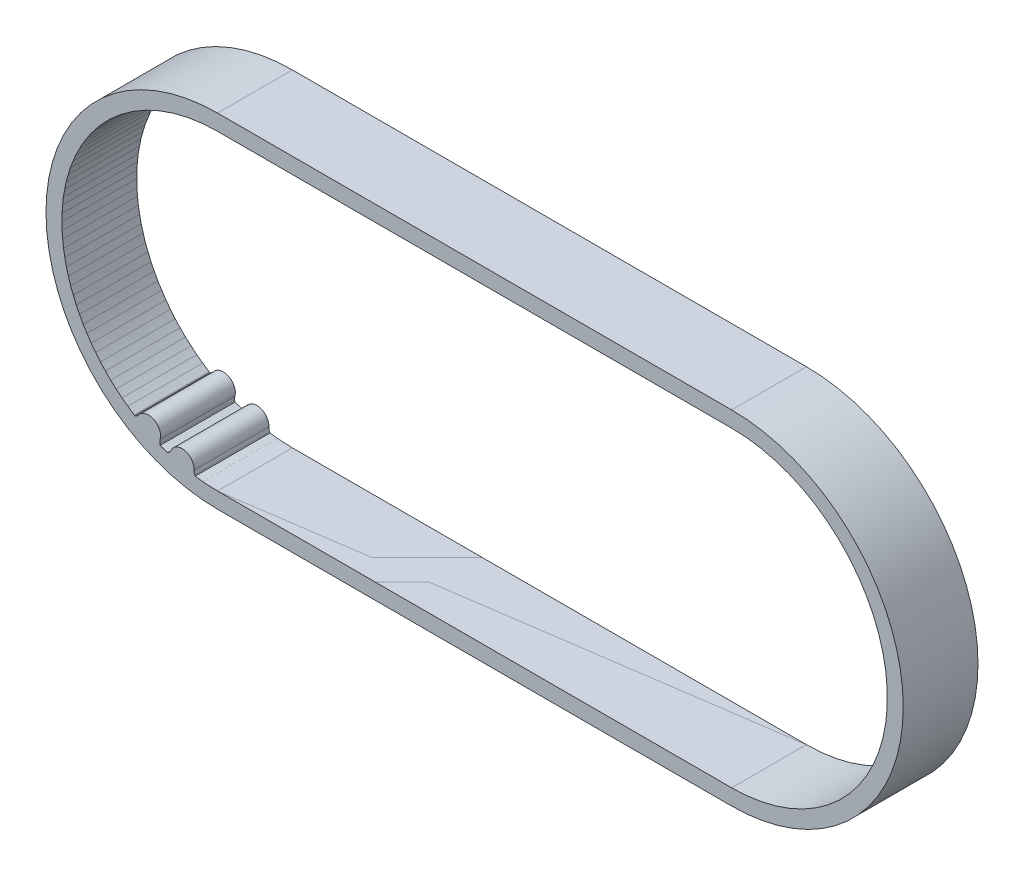
ISO-10303-21;
HEADER;
FILE_DESCRIPTION(('STEP AP214'),'2;1');
FILE_NAME('part.step','',(''),(''),'','','');
FILE_SCHEMA(('AUTOMOTIVE_DESIGN { 1 0 10303 214 1 1 1 1 }'));
ENDSEC;
DATA;
#1=APPLICATION_CONTEXT('core data for automotive mechanical design processes');
#2=APPLICATION_PROTOCOL_DEFINITION('international standard','automotive_design',2000,#1);
#3=PRODUCT_CONTEXT('',#1,'mechanical');
#4=PRODUCT('Part','Part','',(#3));
#5=PRODUCT_RELATED_PRODUCT_CATEGORY('part','',(#4));
#6=PRODUCT_DEFINITION_FORMATION('','',#4);
#7=PRODUCT_DEFINITION_CONTEXT('part definition',#1,'design');
#8=PRODUCT_DEFINITION('design','',#6,#7);
#9=PRODUCT_DEFINITION_SHAPE('','',#8);
#10=(LENGTH_UNIT() NAMED_UNIT(*) SI_UNIT(.MILLI.,.METRE.));
#11=(NAMED_UNIT(*) PLANE_ANGLE_UNIT() SI_UNIT($,.RADIAN.));
#12=(NAMED_UNIT(*) SI_UNIT($,.STERADIAN.) SOLID_ANGLE_UNIT());
#13=UNCERTAINTY_MEASURE_WITH_UNIT(LENGTH_MEASURE(1.E-05),#10,'distance_accuracy_value','');
#14=(GEOMETRIC_REPRESENTATION_CONTEXT(3) GLOBAL_UNCERTAINTY_ASSIGNED_CONTEXT((#13)) GLOBAL_UNIT_ASSIGNED_CONTEXT((#10,
#11,#12)) REPRESENTATION_CONTEXT('',''));
#15=CARTESIAN_POINT('',(0.,0.,0.));
#16=DIRECTION('',(0.,0.,1.));
#17=DIRECTION('',(1.,0.,0.));
#18=AXIS2_PLACEMENT_3D('',#15,#16,#17);
#19=CARTESIAN_POINT('',(-20.625,0.,1.));
#20=DIRECTION('',(0.,0.,-1.));
#21=DIRECTION('',(-1.,0.,0.));
#22=AXIS2_PLACEMENT_3D('',#19,#20,#21);
#23=CYLINDRICAL_SURFACE('',#22,12.4955);
#24=DIRECTION('',(0.,0.,1.));
#25=VECTOR('',#24,1.);
#26=CARTESIAN_POINT('',(-24.6278810964071,-11.8369951508907,3.));
#27=LINE('',#26,#25);
#28=CARTESIAN_POINT('',(-24.6278813586118,-11.836995251793,3.));
#29=VERTEX_POINT('',#28);
#30=CARTESIAN_POINT('',(-24.6278813586118,-11.836995251793,-3.));
#31=VERTEX_POINT('',#30);
#32=EDGE_CURVE('P0_E329',#29,#31,#27,.F.);
#33=ORIENTED_EDGE('',*,*,#32,.T.);
#34=CARTESIAN_POINT('',(-20.625,0.,-3.));
#35=DIRECTION('',(0.,0.,-1.));
#36=DIRECTION('',(-1.,0.,0.));
#37=AXIS2_PLACEMENT_3D('',#34,#35,#36);
#38=CIRCLE('',#37,12.4955);
#39=CARTESIAN_POINT('',(-25.2221486954956,-11.619111158841,-3.));
#40=VERTEX_POINT('',#39);
#41=EDGE_CURVE('P0_E396',#40,#31,#38,.F.);
#42=ORIENTED_EDGE('',*,*,#41,.F.);
#43=DIRECTION('',(0.,0.,-1.));
#44=VECTOR('',#43,1.);
#45=CARTESIAN_POINT('',(-25.2221486954956,-11.619111158841,-3.));
#46=LINE('',#45,#44);
#47=CARTESIAN_POINT('',(-25.2221486954956,-11.619111158841,3.));
#48=VERTEX_POINT('',#47);
#49=EDGE_CURVE('P0_E384',#40,#48,#46,.F.);
#50=ORIENTED_EDGE('',*,*,#49,.T.);
#51=CARTESIAN_POINT('',(-20.625,0.,3.));
#52=DIRECTION('',(0.,0.,-1.));
#53=DIRECTION('',(-1.,0.,0.));
#54=AXIS2_PLACEMENT_3D('',#51,#52,#53);
#55=CIRCLE('',#54,12.4955);
#56=EDGE_CURVE('P0_E333',#29,#48,#55,.T.);
#57=ORIENTED_EDGE('',*,*,#56,.F.);
#58=EDGE_LOOP('',(#33,#42,#50,#57));
#59=FACE_BOUND('',#58,.T.);
#60=ADVANCED_FACE('P0_F18',(#59),#23,.F.);
#61=CARTESIAN_POINT('',(-24.73552499004,-11.55727230491,3.));
#62=DIRECTION('',(0.,0.,1.));
#63=DIRECTION('',(1.,0.,0.));
#64=AXIS2_PLACEMENT_3D('',#61,#62,#63);
#65=CYLINDRICAL_SURFACE('',#64,0.29972);
#66=DIRECTION('',(0.,0.,1.));
#67=VECTOR('',#66,1.);
#68=CARTESIAN_POINT('',(-24.5374042993082,-11.782172883622,3.));
#69=LINE('',#68,#67);
#70=CARTESIAN_POINT('',(-24.5374042993105,-11.782172883624,3.));
#71=VERTEX_POINT('',#70);
#72=CARTESIAN_POINT('',(-24.5374042993111,-11.7821728836234,-3.));
#73=VERTEX_POINT('',#72);
#74=EDGE_CURVE('P0_E324',#71,#73,#69,.F.);
#75=ORIENTED_EDGE('',*,*,#74,.T.);
#76=CARTESIAN_POINT('',(-24.73552499004,-11.55727230491,-3.));
#77=DIRECTION('',(0.,0.,1.));
#78=DIRECTION('',(1.,0.,0.));
#79=AXIS2_PLACEMENT_3D('',#76,#77,#78);
#80=CIRCLE('',#79,0.29972);
#81=EDGE_CURVE('P0_E332',#31,#73,#80,.T.);
#82=ORIENTED_EDGE('',*,*,#81,.F.);
#83=ORIENTED_EDGE('',*,*,#32,.F.);
#84=CARTESIAN_POINT('',(-24.73552499004,-11.55727230491,3.));
#85=DIRECTION('',(0.,0.,1.));
#86=DIRECTION('',(1.,0.,0.));
#87=AXIS2_PLACEMENT_3D('',#84,#85,#86);
#88=CIRCLE('',#87,0.29972);
#89=EDGE_CURVE('P0_E391',#71,#29,#88,.F.);
#90=ORIENTED_EDGE('',*,*,#89,.F.);
#91=EDGE_LOOP('',(#75,#82,#83,#90));
#92=FACE_BOUND('',#91,.T.);
#93=ADVANCED_FACE('P0_F729',(#92),#65,.F.);
#94=CARTESIAN_POINT('',(-24.95920509856,-11.47526143437,3.));
#95=DIRECTION('',(0.,0.,1.));
#96=DIRECTION('',(1.,0.,0.));
#97=AXIS2_PLACEMENT_3D('',#94,#95,#96);
#98=CYLINDRICAL_SURFACE('',#97,0.2997199999997);
#99=CARTESIAN_POINT('',(-24.95920509856,-11.47526143437,-3.));
#100=DIRECTION('',(0.,0.,1.));
#101=DIRECTION('',(1.,0.,0.));
#102=AXIS2_PLACEMENT_3D('',#99,#100,#101);
#103=CIRCLE('',#102,0.2997199999997);
#104=CARTESIAN_POINT('',(-25.2557463221231,-11.5187974094964,-3.));
#105=VERTEX_POINT('',#104);
#106=EDGE_CURVE('P0_E387',#105,#40,#103,.T.);
#107=ORIENTED_EDGE('',*,*,#106,.F.);
#108=DIRECTION('',(0.,0.,1.));
#109=VECTOR('',#108,1.);
#110=CARTESIAN_POINT('',(-25.2557463221225,-11.5187974095004,3.));
#111=LINE('',#110,#109);
#112=CARTESIAN_POINT('',(-25.2557463221209,-11.5187974094961,3.));
#113=VERTEX_POINT('',#112);
#114=EDGE_CURVE('P0_E315',#105,#113,#111,.T.);
#115=ORIENTED_EDGE('',*,*,#114,.T.);
#116=CARTESIAN_POINT('',(-24.95920509856,-11.47526143437,3.));
#117=DIRECTION('',(0.,0.,1.));
#118=DIRECTION('',(1.,0.,0.));
#119=AXIS2_PLACEMENT_3D('',#116,#117,#118);
#120=CIRCLE('',#119,0.2997199999997);
#121=EDGE_CURVE('P0_E389',#48,#113,#120,.F.);
#122=ORIENTED_EDGE('',*,*,#121,.F.);
#123=ORIENTED_EDGE('',*,*,#49,.F.);
#124=EDGE_LOOP('',(#107,#115,#122,#123));
#125=FACE_BOUND('',#124,.T.);
#126=ADVANCED_FACE('P0_F719',(#125),#98,.F.);
#127=CARTESIAN_POINT('',(-21.7900317464,-12.01340435366,3.));
#128=DIRECTION('',(0.,0.,1.));
#129=DIRECTION('',(1.,0.,0.));
#130=AXIS2_PLACEMENT_3D('',#127,#128,#129);
#131=CYLINDRICAL_SURFACE('',#130,0.7162799999994);
#132=CARTESIAN_POINT('',(-21.7900317464,-12.01340435366,-3.));
#133=DIRECTION('',(0.,0.,1.));
#134=DIRECTION('',(1.,0.,0.));
#135=AXIS2_PLACEMENT_3D('',#132,#133,#134);
#136=CIRCLE('',#135,0.7162799999994);
#137=CARTESIAN_POINT('',(-22.5056634445042,-11.9829361560372,-3.));
#138=VERTEX_POINT('',#137);
#139=CARTESIAN_POINT('',(-22.4552012655576,-12.2791232825717,-3.));
#140=VERTEX_POINT('',#139);
#141=EDGE_CURVE('P0_E380',#138,#140,#136,.T.);
#142=ORIENTED_EDGE('',*,*,#141,.F.);
#143=DIRECTION('',(0.,0.,1.));
#144=VECTOR('',#143,1.);
#145=CARTESIAN_POINT('',(-22.5056634445035,-11.9829361560399,3.));
#146=LINE('',#145,#144);
#147=CARTESIAN_POINT('',(-22.5056634445042,-11.9829361560372,3.));
#148=VERTEX_POINT('',#147);
#149=EDGE_CURVE('P0_E303',#148,#138,#146,.F.);
#150=ORIENTED_EDGE('',*,*,#149,.F.);
#151=CARTESIAN_POINT('',(-21.7900317464,-12.01340435366,3.));
#152=DIRECTION('',(0.,0.,1.));
#153=DIRECTION('',(1.,0.,0.));
#154=AXIS2_PLACEMENT_3D('',#151,#152,#153);
#155=CIRCLE('',#154,0.7162799999994);
#156=CARTESIAN_POINT('',(-22.455201265557,-12.2791232825715,3.));
#157=VERTEX_POINT('',#156);
#158=EDGE_CURVE('P0_E382',#157,#148,#155,.F.);
#159=ORIENTED_EDGE('',*,*,#158,.F.);
#160=DIRECTION('',(0.,0.,1.));
#161=VECTOR('',#160,1.);
#162=CARTESIAN_POINT('',(-22.4552012655579,-12.2791232825692,3.));
#163=LINE('',#162,#161);
#164=EDGE_CURVE('P0_E319',#157,#140,#163,.F.);
#165=ORIENTED_EDGE('',*,*,#164,.T.);
#166=EDGE_LOOP('',(#142,#150,#159,#165));
#167=FACE_BOUND('',#166,.T.);
#168=ADVANCED_FACE('P0_F709',(#167),#131,.F.);
#169=CARTESIAN_POINT('',(-25.01087917037,-11.24469861924,3.));
#170=DIRECTION('',(0.,0.,1.));
#171=DIRECTION('',(1.,0.,0.));
#172=AXIS2_PLACEMENT_3D('',#169,#170,#171);
#173=CYLINDRICAL_SURFACE('',#172,0.71628);
#174=CARTESIAN_POINT('',(-25.01087917037,-11.24469861924,-3.));
#175=DIRECTION('',(0.,0.,1.));
#176=DIRECTION('',(1.,0.,0.));
#177=AXIS2_PLACEMENT_3D('',#174,#175,#176);
#178=CIRCLE('',#177,0.71628);
#179=CARTESIAN_POINT('',(-24.3586208480534,-11.5406988208699,-3.));
#180=VERTEX_POINT('',#179);
#181=EDGE_CURVE('P0_E327',#73,#180,#178,.T.);
#182=ORIENTED_EDGE('',*,*,#181,.F.);
#183=ORIENTED_EDGE('',*,*,#74,.F.);
#184=CARTESIAN_POINT('',(-25.01087917037,-11.24469861924,3.));
#185=DIRECTION('',(0.,0.,1.));
#186=DIRECTION('',(1.,0.,0.));
#187=AXIS2_PLACEMENT_3D('',#184,#185,#186);
#188=CIRCLE('',#187,0.71628);
#189=CARTESIAN_POINT('',(-24.3586208480534,-11.5406988208699,3.));
#190=VERTEX_POINT('',#189);
#191=EDGE_CURVE('P0_E328',#190,#71,#188,.F.);
#192=ORIENTED_EDGE('',*,*,#191,.F.);
#193=DIRECTION('',(0.,0.,1.));
#194=VECTOR('',#193,1.);
#195=CARTESIAN_POINT('',(-24.3586208480553,-11.5406988208676,3.));
#196=LINE('',#195,#194);
#197=EDGE_CURVE('P0_E306',#180,#190,#196,.T.);
#198=ORIENTED_EDGE('',*,*,#197,.F.);
#199=EDGE_LOOP('',(#182,#183,#192,#198));
#200=FACE_BOUND('',#199,.T.);
#201=ADVANCED_FACE('P0_F699',(#200),#173,.F.);
#202=CARTESIAN_POINT('',(-22.17686792066,-12.16793592934,3.));
#203=DIRECTION('',(0.,0.,1.));
#204=DIRECTION('',(1.,0.,0.));
#205=AXIS2_PLACEMENT_3D('',#202,#203,#204);
#206=CYLINDRICAL_SURFACE('',#205,0.2997200000003);
#207=ORIENTED_EDGE('',*,*,#164,.F.);
#208=CARTESIAN_POINT('',(-22.17686792066,-12.16793592934,3.));
#209=DIRECTION('',(0.,0.,1.));
#210=DIRECTION('',(1.,0.,0.));
#211=AXIS2_PLACEMENT_3D('',#208,#209,#210);
#212=CIRCLE('',#211,0.2997200000003);
#213=CARTESIAN_POINT('',(-22.399234096965,-12.3688970251663,3.));
#214=VERTEX_POINT('',#213);
#215=EDGE_CURVE('P0_E323',#214,#157,#212,.F.);
#216=ORIENTED_EDGE('',*,*,#215,.F.);
#217=DIRECTION('',(0.,0.,1.));
#218=VECTOR('',#217,1.);
#219=CARTESIAN_POINT('',(-22.399234096965,-12.3688970251663,3.));
#220=LINE('',#219,#218);
#221=CARTESIAN_POINT('',(-22.399234096965,-12.3688970251663,-3.));
#222=VERTEX_POINT('',#221);
#223=EDGE_CURVE('P0_E302',#214,#222,#220,.F.);
#224=ORIENTED_EDGE('',*,*,#223,.T.);
#225=CARTESIAN_POINT('',(-22.17686792066,-12.16793592934,-3.));
#226=DIRECTION('',(0.,0.,1.));
#227=DIRECTION('',(1.,0.,0.));
#228=AXIS2_PLACEMENT_3D('',#225,#226,#227);
#229=CIRCLE('',#228,0.2997200000003);
#230=EDGE_CURVE('P0_E322',#140,#222,#229,.T.);
#231=ORIENTED_EDGE('',*,*,#230,.F.);
#232=EDGE_LOOP('',(#207,#216,#224,#231));
#233=FACE_BOUND('',#232,.T.);
#234=ADVANCED_FACE('P0_F689',(#233),#206,.F.);
#235=CARTESIAN_POINT('',(-27.30619948487,-10.28729956145,3.));
#236=DIRECTION('',(0.,0.,1.));
#237=DIRECTION('',(1.,0.,0.));
#238=AXIS2_PLACEMENT_3D('',#235,#236,#237);
#239=CYLINDRICAL_SURFACE('',#238,0.29972);
#240=DIRECTION('',(0.,0.,1.));
#241=VECTOR('',#240,1.);
#242=CARTESIAN_POINT('',(-27.1657009189482,-10.5520489360934,3.));
#243=LINE('',#242,#241);
#244=CARTESIAN_POINT('',(-27.1657009189499,-10.5520489360943,3.));
#245=VERTEX_POINT('',#244);
#246=CARTESIAN_POINT('',(-27.16570091895,-10.5520489360942,-3.));
#247=VERTEX_POINT('',#246);
#248=EDGE_CURVE('P0_E311',#245,#247,#243,.F.);
#249=ORIENTED_EDGE('',*,*,#248,.T.);
#250=CARTESIAN_POINT('',(-27.30619948487,-10.28729956145,-3.));
#251=DIRECTION('',(0.,0.,1.));
#252=DIRECTION('',(1.,0.,0.));
#253=AXIS2_PLACEMENT_3D('',#250,#251,#252);
#254=CIRCLE('',#253,0.29972);
#255=CARTESIAN_POINT('',(-27.2664332892186,-10.5843698024426,-3.));
#256=VERTEX_POINT('',#255);
#257=EDGE_CURVE('P0_E374',#256,#247,#254,.T.);
#258=ORIENTED_EDGE('',*,*,#257,.F.);
#259=DIRECTION('',(0.,0.,1.));
#260=VECTOR('',#259,1.);
#261=CARTESIAN_POINT('',(-27.2664332892186,-10.5843698024426,-3.));
#262=LINE('',#261,#260);
#263=CARTESIAN_POINT('',(-27.2664332892186,-10.5843698024426,3.));
#264=VERTEX_POINT('',#263);
#265=EDGE_CURVE('P0_E295',#256,#264,#262,.T.);
#266=ORIENTED_EDGE('',*,*,#265,.T.);
#267=CARTESIAN_POINT('',(-27.30619948487,-10.28729956145,3.));
#268=DIRECTION('',(0.,0.,1.));
#269=DIRECTION('',(1.,0.,0.));
#270=AXIS2_PLACEMENT_3D('',#267,#268,#269);
#271=CIRCLE('',#270,0.29972);
#272=EDGE_CURVE('P0_E372',#245,#264,#271,.F.);
#273=ORIENTED_EDGE('',*,*,#272,.F.);
#274=EDGE_LOOP('',(#249,#258,#266,#273));
#275=FACE_BOUND('',#274,.T.);
#276=ADVANCED_FACE('P0_F679',(#275),#239,.F.);
#277=CARTESIAN_POINT('',(-24.54706305904,-11.41475380793,3.));
#278=DIRECTION('',(0.,0.,1.));
#279=DIRECTION('',(1.,0.,0.));
#280=AXIS2_PLACEMENT_3D('',#277,#278,#279);
#281=CYLINDRICAL_SURFACE('',#280,0.7162800000007);
#282=CARTESIAN_POINT('',(-24.54706305904,-11.41475380793,-3.));
#283=DIRECTION('',(0.,0.,1.));
#284=DIRECTION('',(1.,0.,0.));
#285=AXIS2_PLACEMENT_3D('',#282,#283,#284);
#286=CIRCLE('',#285,0.7162800000007);
#287=CARTESIAN_POINT('',(-25.236071394313,-11.2189872318174,-3.));
#288=VERTEX_POINT('',#287);
#289=EDGE_CURVE('P0_E318',#288,#105,#286,.T.);
#290=ORIENTED_EDGE('',*,*,#289,.F.);
#291=DIRECTION('',(0.,0.,1.));
#292=VECTOR('',#291,1.);
#293=CARTESIAN_POINT('',(-25.2360713943119,-11.2189872318195,3.));
#294=LINE('',#293,#292);
#295=CARTESIAN_POINT('',(-25.236071394313,-11.2189872318174,3.));
#296=VERTEX_POINT('',#295);
#297=EDGE_CURVE('P0_E287',#296,#288,#294,.F.);
#298=ORIENTED_EDGE('',*,*,#297,.F.);
#299=CARTESIAN_POINT('',(-24.54706305904,-11.41475380793,3.));
#300=DIRECTION('',(0.,0.,1.));
#301=DIRECTION('',(1.,0.,0.));
#302=AXIS2_PLACEMENT_3D('',#299,#300,#301);
#303=CIRCLE('',#302,0.7162800000007);
#304=EDGE_CURVE('P0_E370',#113,#296,#303,.F.);
#305=ORIENTED_EDGE('',*,*,#304,.F.);
#306=ORIENTED_EDGE('',*,*,#114,.F.);
#307=EDGE_LOOP('',(#290,#298,#305,#306));
#308=FACE_BOUND('',#307,.T.);
#309=ADVANCED_FACE('P0_F669',(#308),#281,.F.);
#310=CARTESIAN_POINT('',(-27.50146867818,-9.919342803469,3.));
#311=DIRECTION('',(0.,0.,1.));
#312=DIRECTION('',(1.,0.,0.));
#313=AXIS2_PLACEMENT_3D('',#310,#311,#312);
#314=CYLINDRICAL_SURFACE('',#313,0.71628);
#315=CARTESIAN_POINT('',(-27.50146867818,-9.919342803469,-3.));
#316=DIRECTION('',(0.,0.,1.));
#317=DIRECTION('',(1.,0.,0.));
#318=AXIS2_PLACEMENT_3D('',#315,#316,#317);
#319=CIRCLE('',#318,0.71628);
#320=CARTESIAN_POINT('',(-26.935744506529,-10.3586754792499,-3.));
#321=VERTEX_POINT('',#320);
#322=EDGE_CURVE('P0_E307',#247,#321,#319,.T.);
#323=ORIENTED_EDGE('',*,*,#322,.F.);
#324=ORIENTED_EDGE('',*,*,#248,.F.);
#325=CARTESIAN_POINT('',(-27.50146867818,-9.919342803469,3.));
#326=DIRECTION('',(0.,0.,1.));
#327=DIRECTION('',(1.,0.,0.));
#328=AXIS2_PLACEMENT_3D('',#325,#326,#327);
#329=CIRCLE('',#328,0.71628);
#330=CARTESIAN_POINT('',(-26.935744506529,-10.3586754792499,3.));
#331=VERTEX_POINT('',#330);
#332=EDGE_CURVE('P0_E314',#331,#245,#329,.F.);
#333=ORIENTED_EDGE('',*,*,#332,.F.);
#334=DIRECTION('',(0.,0.,1.));
#335=VECTOR('',#334,1.);
#336=CARTESIAN_POINT('',(-26.93574450653,-10.35867547925,3.));
#337=LINE('',#336,#335);
#338=EDGE_CURVE('P0_E290',#321,#331,#337,.T.);
#339=ORIENTED_EDGE('',*,*,#338,.F.);
#340=EDGE_LOOP('',(#323,#324,#333,#339));
#341=FACE_BOUND('',#340,.T.);
#342=ADVANCED_FACE('P0_F659',(#341),#314,.F.);
#343=CARTESIAN_POINT('',(-23.47506524832,-11.94166363301,3.));
#344=DIRECTION('',(0.,0.,1.));
#345=DIRECTION('',(1.,0.,0.));
#346=AXIS2_PLACEMENT_3D('',#343,#344,#345);
#347=CYLINDRICAL_SURFACE('',#346,0.97028);
#348=ORIENTED_EDGE('',*,*,#197,.T.);
#349=CARTESIAN_POINT('',(-23.47506524832,-11.94166363301,3.));
#350=DIRECTION('',(0.,0.,1.));
#351=DIRECTION('',(1.,0.,0.));
#352=AXIS2_PLACEMENT_3D('',#349,#350,#351);
#353=CIRCLE('',#352,0.97028);
#354=EDGE_CURVE('P0_E355',#148,#190,#353,.T.);
#355=ORIENTED_EDGE('',*,*,#354,.F.);
#356=ORIENTED_EDGE('',*,*,#149,.T.);
#357=CARTESIAN_POINT('',(-23.47506524832,-11.94166363301,-3.));
#358=DIRECTION('',(0.,0.,1.));
#359=DIRECTION('',(1.,0.,0.));
#360=AXIS2_PLACEMENT_3D('',#357,#358,#359);
#361=CIRCLE('',#360,0.97028);
#362=EDGE_CURVE('P0_E346',#180,#138,#361,.F.);
#363=ORIENTED_EDGE('',*,*,#362,.F.);
#364=EDGE_LOOP('',(#348,#355,#356,#363));
#365=FACE_BOUND('',#364,.T.);
#366=ADVANCED_FACE('P0_F649',(#365),#347,.T.);
#367=CARTESIAN_POINT('',(-20.625,0.,1.));
#368=DIRECTION('',(0.,0.,-1.));
#369=DIRECTION('',(-1.,0.,0.));
#370=AXIS2_PLACEMENT_3D('',#367,#368,#369);
#371=CYLINDRICAL_SURFACE('',#370,12.4955);
#372=CARTESIAN_POINT('',(-20.625,0.,-3.));
#373=DIRECTION('',(0.,0.,-1.));
#374=DIRECTION('',(-1.,0.,0.));
#375=AXIS2_PLACEMENT_3D('',#372,#373,#374);
#376=CIRCLE('',#375,12.4955);
#377=CARTESIAN_POINT('',(-20.625,-12.4955,-3.));
#378=VERTEX_POINT('',#377);
#379=EDGE_CURVE('P0_E256',#222,#378,#376,.F.);
#380=ORIENTED_EDGE('',*,*,#379,.F.);
#381=ORIENTED_EDGE('',*,*,#223,.F.);
#382=CARTESIAN_POINT('',(-20.625,0.,3.));
#383=DIRECTION('',(0.,0.,-1.));
#384=DIRECTION('',(-1.,0.,0.));
#385=AXIS2_PLACEMENT_3D('',#382,#383,#384);
#386=CIRCLE('',#385,12.4955);
#387=CARTESIAN_POINT('',(-20.625,-12.4955,3.));
#388=VERTEX_POINT('',#387);
#389=EDGE_CURVE('P0_E276',#388,#214,#386,.T.);
#390=ORIENTED_EDGE('',*,*,#389,.F.);
#391=DIRECTION('',(0.,0.,1.));
#392=VECTOR('',#391,1.);
#393=CARTESIAN_POINT('',(-20.625,-12.4955,3.));
#394=LINE('',#393,#392);
#395=EDGE_CURVE('P0_E300',#378,#388,#394,.T.);
#396=ORIENTED_EDGE('',*,*,#395,.F.);
#397=EDGE_LOOP('',(#380,#381,#390,#396));
#398=FACE_BOUND('',#397,.T.);
#399=ADVANCED_FACE('P0_F639',(#398),#371,.F.);
#400=CARTESIAN_POINT('',(20.625,-12.4955,3.));
#401=DIRECTION('',(0.,1.,0.));
#402=DIRECTION('',(0.,0.,1.));
#403=AXIS2_PLACEMENT_3D('',#400,#401,#402);
#404=PLANE('',#403);
#405=DIRECTION('',(1.,0.,0.));
#406=VECTOR('',#405,1.);
#407=CARTESIAN_POINT('',(-20.625,-12.4955,3.));
#408=LINE('',#407,#406);
#409=CARTESIAN_POINT('',(20.625,-12.4955,3.));
#410=VERTEX_POINT('',#409);
#411=EDGE_CURVE('P0_E273',#410,#388,#408,.F.);
#412=ORIENTED_EDGE('',*,*,#411,.F.);
#413=DIRECTION('',(0.,0.,-1.));
#414=VECTOR('',#413,1.);
#415=CARTESIAN_POINT('',(20.625,-12.4955,1.));
#416=LINE('',#415,#414);
#417=CARTESIAN_POINT('',(20.625,-12.4955,-3.));
#418=VERTEX_POINT('',#417);
#419=EDGE_CURVE('P0_E298',#410,#418,#416,.T.);
#420=ORIENTED_EDGE('',*,*,#419,.T.);
#421=DIRECTION('',(-1.,0.,0.));
#422=VECTOR('',#421,1.);
#423=CARTESIAN_POINT('',(-20.625,-12.4955,-3.));
#424=LINE('',#423,#422);
#425=EDGE_CURVE('P0_E253',#378,#418,#424,.F.);
#426=ORIENTED_EDGE('',*,*,#425,.F.);
#427=ORIENTED_EDGE('',*,*,#395,.T.);
#428=EDGE_LOOP('',(#412,#420,#426,#427));
#429=FACE_BOUND('',#428,.T.);
#430=ADVANCED_FACE('P0_F629',(#429),#404,.T.);
#431=CARTESIAN_POINT('',(20.625,0.,1.));
#432=DIRECTION('',(0.,0.,-1.));
#433=DIRECTION('',(-1.,0.,0.));
#434=AXIS2_PLACEMENT_3D('',#431,#432,#433);
#435=CYLINDRICAL_SURFACE('',#434,12.4955);
#436=ORIENTED_EDGE('',*,*,#419,.F.);
#437=CARTESIAN_POINT('',(20.625,0.,3.));
#438=DIRECTION('',(0.,0.,-1.));
#439=DIRECTION('',(-1.,0.,0.));
#440=AXIS2_PLACEMENT_3D('',#437,#438,#439);
#441=CIRCLE('',#440,12.4955);
#442=CARTESIAN_POINT('',(20.625,12.4955,3.));
#443=VERTEX_POINT('',#442);
#444=EDGE_CURVE('P0_E277',#443,#410,#441,.T.);
#445=ORIENTED_EDGE('',*,*,#444,.F.);
#446=DIRECTION('',(0.,0.,-1.));
#447=VECTOR('',#446,1.);
#448=CARTESIAN_POINT('',(20.625,12.4955,3.));
#449=LINE('',#448,#447);
#450=CARTESIAN_POINT('',(20.625,12.4955,-3.));
#451=VERTEX_POINT('',#450);
#452=EDGE_CURVE('P0_E296',#451,#443,#449,.F.);
#453=ORIENTED_EDGE('',*,*,#452,.F.);
#454=CARTESIAN_POINT('',(20.625,0.,-3.));
#455=DIRECTION('',(0.,0.,-1.));
#456=DIRECTION('',(-1.,0.,0.));
#457=AXIS2_PLACEMENT_3D('',#454,#455,#456);
#458=CIRCLE('',#457,12.4955);
#459=EDGE_CURVE('P0_E252',#418,#451,#458,.F.);
#460=ORIENTED_EDGE('',*,*,#459,.F.);
#461=EDGE_LOOP('',(#436,#445,#453,#460));
#462=FACE_BOUND('',#461,.T.);
#463=ADVANCED_FACE('P0_F619',(#462),#435,.F.);
#464=CARTESIAN_POINT('',(-20.625,12.4955,3.));
#465=DIRECTION('',(0.,-1.,0.));
#466=DIRECTION('',(0.,0.,-1.));
#467=AXIS2_PLACEMENT_3D('',#464,#465,#466);
#468=PLANE('',#467);
#469=DIRECTION('',(1.,0.,0.));
#470=VECTOR('',#469,1.);
#471=CARTESIAN_POINT('',(-20.625,12.4955,3.));
#472=LINE('',#471,#470);
#473=CARTESIAN_POINT('',(-20.625,12.4955,3.));
#474=VERTEX_POINT('',#473);
#475=EDGE_CURVE('P0_E278',#474,#443,#472,.T.);
#476=ORIENTED_EDGE('',*,*,#475,.F.);
#477=DIRECTION('',(0.,0.,-1.));
#478=VECTOR('',#477,1.);
#479=CARTESIAN_POINT('',(-20.625,12.4955,1.));
#480=LINE('',#479,#478);
#481=CARTESIAN_POINT('',(-20.625,12.4955,-3.));
#482=VERTEX_POINT('',#481);
#483=EDGE_CURVE('P0_E291',#474,#482,#480,.T.);
#484=ORIENTED_EDGE('',*,*,#483,.T.);
#485=DIRECTION('',(-1.,0.,0.));
#486=VECTOR('',#485,1.);
#487=CARTESIAN_POINT('',(-20.625,12.4955,-3.));
#488=LINE('',#487,#486);
#489=EDGE_CURVE('P0_E248',#451,#482,#488,.T.);
#490=ORIENTED_EDGE('',*,*,#489,.F.);
#491=ORIENTED_EDGE('',*,*,#452,.T.);
#492=EDGE_LOOP('',(#476,#484,#490,#491));
#493=FACE_BOUND('',#492,.T.);
#494=ADVANCED_FACE('P0_F609',(#493),#468,.T.);
#495=CARTESIAN_POINT('',(-20.625,0.,1.));
#496=DIRECTION('',(0.,0.,-1.));
#497=DIRECTION('',(-1.,0.,0.));
#498=AXIS2_PLACEMENT_3D('',#495,#496,#497);
#499=CYLINDRICAL_SURFACE('',#498,12.4955);
#500=ORIENTED_EDGE('',*,*,#483,.F.);
#501=CARTESIAN_POINT('',(-20.625,0.,3.));
#502=DIRECTION('',(0.,0.,-1.));
#503=DIRECTION('',(-1.,0.,0.));
#504=AXIS2_PLACEMENT_3D('',#501,#502,#503);
#505=CIRCLE('',#504,12.4955);
#506=EDGE_CURVE('P0_E272',#264,#474,#505,.T.);
#507=ORIENTED_EDGE('',*,*,#506,.F.);
#508=ORIENTED_EDGE('',*,*,#265,.F.);
#509=CARTESIAN_POINT('',(-20.625,0.,-3.));
#510=DIRECTION('',(0.,0.,-1.));
#511=DIRECTION('',(-1.,0.,0.));
#512=AXIS2_PLACEMENT_3D('',#509,#510,#511);
#513=CIRCLE('',#512,12.4955);
#514=EDGE_CURVE('P0_E251',#482,#256,#513,.F.);
#515=ORIENTED_EDGE('',*,*,#514,.F.);
#516=EDGE_LOOP('',(#500,#507,#508,#515));
#517=FACE_BOUND('',#516,.T.);
#518=ADVANCED_FACE('P0_F599',(#517),#499,.F.);
#519=CARTESIAN_POINT('',(-26.16940892649,-10.95379988403,3.));
#520=DIRECTION('',(0.,0.,1.));
#521=DIRECTION('',(1.,0.,0.));
#522=AXIS2_PLACEMENT_3D('',#519,#520,#521);
#523=CYLINDRICAL_SURFACE('',#522,0.97028);
#524=ORIENTED_EDGE('',*,*,#338,.T.);
#525=CARTESIAN_POINT('',(-26.16940892649,-10.95379988403,3.));
#526=DIRECTION('',(0.,0.,1.));
#527=DIRECTION('',(1.,0.,0.));
#528=AXIS2_PLACEMENT_3D('',#525,#526,#527);
#529=CIRCLE('',#528,0.97028);
#530=EDGE_CURVE('P0_E352',#296,#331,#529,.T.);
#531=ORIENTED_EDGE('',*,*,#530,.F.);
#532=ORIENTED_EDGE('',*,*,#297,.T.);
#533=CARTESIAN_POINT('',(-26.16940892649,-10.95379988403,-3.));
#534=DIRECTION('',(0.,0.,1.));
#535=DIRECTION('',(1.,0.,0.));
#536=AXIS2_PLACEMENT_3D('',#533,#534,#535);
#537=CIRCLE('',#536,0.97028);
#538=EDGE_CURVE('P0_E284',#321,#288,#537,.F.);
#539=ORIENTED_EDGE('',*,*,#538,.F.);
#540=EDGE_LOOP('',(#524,#531,#532,#539));
#541=FACE_BOUND('',#540,.T.);
#542=ADVANCED_FACE('P0_F589',(#541),#523,.T.);
#543=CARTESIAN_POINT('',(20.625,0.,1.));
#544=DIRECTION('',(0.,0.,-1.));
#545=DIRECTION('',(-1.,0.,0.));
#546=AXIS2_PLACEMENT_3D('',#543,#544,#545);
#547=CYLINDRICAL_SURFACE('',#546,13.7655);
#548=CARTESIAN_POINT('',(20.625,0.,-3.));
#549=DIRECTION('',(0.,0.,-1.));
#550=DIRECTION('',(-1.,0.,0.));
#551=AXIS2_PLACEMENT_3D('',#548,#549,#550);
#552=CIRCLE('',#551,13.7655);
#553=CARTESIAN_POINT('',(20.625,13.7655,-3.));
#554=VERTEX_POINT('',#553);
#555=CARTESIAN_POINT('',(20.625,-13.7655,-3.));
#556=VERTEX_POINT('',#555);
#557=EDGE_CURVE('P0_E260',#554,#556,#552,.T.);
#558=ORIENTED_EDGE('',*,*,#557,.F.);
#559=DIRECTION('',(0.,0.,1.));
#560=VECTOR('',#559,1.);
#561=CARTESIAN_POINT('',(20.625,13.7655,-3.));
#562=LINE('',#561,#560);
#563=CARTESIAN_POINT('',(20.625,13.7655,3.));
#564=VERTEX_POINT('',#563);
#565=EDGE_CURVE('P0_E261',#564,#554,#562,.F.);
#566=ORIENTED_EDGE('',*,*,#565,.F.);
#567=CARTESIAN_POINT('',(20.625,0.,3.));
#568=DIRECTION('',(0.,0.,-1.));
#569=DIRECTION('',(-1.,0.,0.));
#570=AXIS2_PLACEMENT_3D('',#567,#568,#569);
#571=CIRCLE('',#570,13.7655);
#572=CARTESIAN_POINT('',(20.625,-13.7655,3.));
#573=VERTEX_POINT('',#572);
#574=EDGE_CURVE('P0_E281',#573,#564,#571,.F.);
#575=ORIENTED_EDGE('',*,*,#574,.F.);
#576=DIRECTION('',(0.,0.,-1.));
#577=VECTOR('',#576,1.);
#578=CARTESIAN_POINT('',(20.625,-13.7655,-3.));
#579=LINE('',#578,#577);
#580=EDGE_CURVE('P0_E267',#556,#573,#579,.F.);
#581=ORIENTED_EDGE('',*,*,#580,.F.);
#582=EDGE_LOOP('',(#558,#566,#575,#581));
#583=FACE_BOUND('',#582,.T.);
#584=ADVANCED_FACE('P0_F579',(#583),#547,.T.);
#585=CARTESIAN_POINT('',(-20.625,13.7655,3.));
#586=DIRECTION('',(0.,0.,1.));
#587=DIRECTION('',(1.,0.,0.));
#588=AXIS2_PLACEMENT_3D('',#585,#586,#587);
#589=PLANE('',#588);
#590=ORIENTED_EDGE('',*,*,#272,.T.);
#591=ORIENTED_EDGE('',*,*,#506,.T.);
#592=ORIENTED_EDGE('',*,*,#475,.T.);
#593=ORIENTED_EDGE('',*,*,#444,.T.);
#594=ORIENTED_EDGE('',*,*,#411,.T.);
#595=ORIENTED_EDGE('',*,*,#389,.T.);
#596=ORIENTED_EDGE('',*,*,#215,.T.);
#597=ORIENTED_EDGE('',*,*,#158,.T.);
#598=ORIENTED_EDGE('',*,*,#354,.T.);
#599=ORIENTED_EDGE('',*,*,#191,.T.);
#600=ORIENTED_EDGE('',*,*,#89,.T.);
#601=ORIENTED_EDGE('',*,*,#56,.T.);
#602=ORIENTED_EDGE('',*,*,#121,.T.);
#603=ORIENTED_EDGE('',*,*,#304,.T.);
#604=ORIENTED_EDGE('',*,*,#530,.T.);
#605=ORIENTED_EDGE('',*,*,#332,.T.);
#606=EDGE_LOOP('',(#590,#591,#592,#593,#594,#595,#596,#597,#598,#599,#600,#601,#602,#603,#604,#605));
#607=FACE_BOUND('',#606,.T.);
#608=ORIENTED_EDGE('',*,*,#574,.T.);
#609=DIRECTION('',(1.,0.,0.));
#610=VECTOR('',#609,1.);
#611=CARTESIAN_POINT('',(-20.625,13.7655,3.));
#612=LINE('',#611,#610);
#613=CARTESIAN_POINT('',(-20.625,13.7655,3.));
#614=VERTEX_POINT('',#613);
#615=EDGE_CURVE('P0_E269',#614,#564,#612,.T.);
#616=ORIENTED_EDGE('',*,*,#615,.F.);
#617=CARTESIAN_POINT('',(-20.625,0.,3.));
#618=DIRECTION('',(0.,0.,-1.));
#619=DIRECTION('',(-1.,0.,0.));
#620=AXIS2_PLACEMENT_3D('',#617,#618,#619);
#621=CIRCLE('',#620,13.7655);
#622=CARTESIAN_POINT('',(-20.625,-13.7655,3.));
#623=VERTEX_POINT('',#622);
#624=EDGE_CURVE('P0_E264',#623,#614,#621,.T.);
#625=ORIENTED_EDGE('',*,*,#624,.F.);
#626=DIRECTION('',(1.,0.,0.));
#627=VECTOR('',#626,1.);
#628=CARTESIAN_POINT('',(20.625,-13.7655,3.));
#629=LINE('',#628,#627);
#630=EDGE_CURVE('P0_E268',#573,#623,#629,.F.);
#631=ORIENTED_EDGE('',*,*,#630,.F.);
#632=EDGE_LOOP('',(#608,#616,#625,#631));
#633=FACE_BOUND('',#632,.T.);
#634=ADVANCED_FACE('P0_F569',(#607,#633),#589,.T.);
#635=CARTESIAN_POINT('',(-20.625,13.7655,-3.));
#636=DIRECTION('',(0.,1.,0.));
#637=DIRECTION('',(0.,0.,1.));
#638=AXIS2_PLACEMENT_3D('',#635,#636,#637);
#639=PLANE('',#638);
#640=DIRECTION('',(-1.,0.,0.));
#641=VECTOR('',#640,1.);
#642=CARTESIAN_POINT('',(-20.625,13.7655,-3.));
#643=LINE('',#642,#641);
#644=CARTESIAN_POINT('',(-20.625,13.7655,-3.));
#645=VERTEX_POINT('',#644);
#646=EDGE_CURVE('P0_E257',#645,#554,#643,.F.);
#647=ORIENTED_EDGE('',*,*,#646,.F.);
#648=DIRECTION('',(0.,0.,-1.));
#649=VECTOR('',#648,1.);
#650=CARTESIAN_POINT('',(-20.625,13.7655,1.));
#651=LINE('',#650,#649);
#652=EDGE_CURVE('P0_E262',#614,#645,#651,.T.);
#653=ORIENTED_EDGE('',*,*,#652,.F.);
#654=ORIENTED_EDGE('',*,*,#615,.T.);
#655=ORIENTED_EDGE('',*,*,#565,.T.);
#656=EDGE_LOOP('',(#647,#653,#654,#655));
#657=FACE_BOUND('',#656,.T.);
#658=ADVANCED_FACE('P0_F559',(#657),#639,.T.);
#659=CARTESIAN_POINT('',(-20.625,12.4955,-3.));
#660=DIRECTION('',(0.,0.,-1.));
#661=DIRECTION('',(-1.,0.,0.));
#662=AXIS2_PLACEMENT_3D('',#659,#660,#661);
#663=PLANE('',#662);
#664=ORIENTED_EDGE('',*,*,#106,.T.);
#665=ORIENTED_EDGE('',*,*,#41,.T.);
#666=ORIENTED_EDGE('',*,*,#81,.T.);
#667=ORIENTED_EDGE('',*,*,#181,.T.);
#668=ORIENTED_EDGE('',*,*,#362,.T.);
#669=ORIENTED_EDGE('',*,*,#141,.T.);
#670=ORIENTED_EDGE('',*,*,#230,.T.);
#671=ORIENTED_EDGE('',*,*,#379,.T.);
#672=ORIENTED_EDGE('',*,*,#425,.T.);
#673=ORIENTED_EDGE('',*,*,#459,.T.);
#674=ORIENTED_EDGE('',*,*,#489,.T.);
#675=ORIENTED_EDGE('',*,*,#514,.T.);
#676=ORIENTED_EDGE('',*,*,#257,.T.);
#677=ORIENTED_EDGE('',*,*,#322,.T.);
#678=ORIENTED_EDGE('',*,*,#538,.T.);
#679=ORIENTED_EDGE('',*,*,#289,.T.);
#680=EDGE_LOOP('',(#664,#665,#666,#667,#668,#669,#670,#671,#672,#673,#674,#675,#676,#677,#678,#679));
#681=FACE_BOUND('',#680,.T.);
#682=DIRECTION('',(1.,0.,0.));
#683=VECTOR('',#682,1.);
#684=CARTESIAN_POINT('',(20.625,-13.7655,-3.));
#685=LINE('',#684,#683);
#686=CARTESIAN_POINT('',(-20.625,-13.7655,-3.));
#687=VERTEX_POINT('',#686);
#688=EDGE_CURVE('P0_E36',#687,#556,#685,.T.);
#689=ORIENTED_EDGE('',*,*,#688,.F.);
#690=CARTESIAN_POINT('',(-20.625,0.,-3.));
#691=DIRECTION('',(0.,0.,-1.));
#692=DIRECTION('',(-1.,0.,0.));
#693=AXIS2_PLACEMENT_3D('',#690,#691,#692);
#694=CIRCLE('',#693,13.7655);
#695=EDGE_CURVE('P0_E27',#645,#687,#694,.F.);
#696=ORIENTED_EDGE('',*,*,#695,.F.);
#697=ORIENTED_EDGE('',*,*,#646,.T.);
#698=ORIENTED_EDGE('',*,*,#557,.T.);
#699=EDGE_LOOP('',(#689,#696,#697,#698));
#700=FACE_BOUND('',#699,.T.);
#701=ADVANCED_FACE('P0_F549',(#681,#700),#663,.T.);
#702=CARTESIAN_POINT('',(20.625,-13.7655,-3.));
#703=DIRECTION('',(0.,-1.,0.));
#704=DIRECTION('',(0.,0.,-1.));
#705=AXIS2_PLACEMENT_3D('',#702,#703,#704);
#706=PLANE('',#705);
#707=ORIENTED_EDGE('',*,*,#688,.T.);
#708=ORIENTED_EDGE('',*,*,#580,.T.);
#709=ORIENTED_EDGE('',*,*,#630,.T.);
#710=DIRECTION('',(0.,0.,-1.));
#711=VECTOR('',#710,1.);
#712=CARTESIAN_POINT('',(-20.625,-13.7655,1.));
#713=LINE('',#712,#711);
#714=EDGE_CURVE('P0_E11',#687,#623,#713,.F.);
#715=ORIENTED_EDGE('',*,*,#714,.F.);
#716=EDGE_LOOP('',(#707,#708,#709,#715));
#717=FACE_BOUND('',#716,.T.);
#718=ADVANCED_FACE('P0_F539',(#717),#706,.T.);
#719=CARTESIAN_POINT('',(-20.625,0.,1.));
#720=DIRECTION('',(0.,0.,-1.));
#721=DIRECTION('',(-1.,0.,0.));
#722=AXIS2_PLACEMENT_3D('',#719,#720,#721);
#723=CYLINDRICAL_SURFACE('',#722,13.7655);
#724=ORIENTED_EDGE('',*,*,#695,.T.);
#725=ORIENTED_EDGE('',*,*,#714,.T.);
#726=ORIENTED_EDGE('',*,*,#624,.T.);
#727=ORIENTED_EDGE('',*,*,#652,.T.);
#728=EDGE_LOOP('',(#724,#725,#726,#727));
#729=FACE_BOUND('',#728,.T.);
#730=ADVANCED_FACE('P0_F536',(#729),#723,.T.);
#731=CLOSED_SHELL('',(#60,#93,#126,#168,#201,#234,#276,#309,#342,#366,#399,#430,#463,#494,#518,
#542,#584,#634,#658,#701,#718,#730));
#732=CARTESIAN_POINT('',(-20.625,0.,1.));
#733=DIRECTION('',(0.,0.,-1.));
#734=DIRECTION('',(-1.,0.,0.));
#735=AXIS2_PLACEMENT_3D('',#732,#733,#734);
#736=CYLINDRICAL_SURFACE('',#735,12.6225);
#737=DIRECTION('',(0.,0.,1.));
#738=VECTOR('',#737,1.);
#739=CARTESIAN_POINT('',(-20.625,12.6225,-2.873));
#740=LINE('',#739,#738);
#741=CARTESIAN_POINT('',(-20.625,12.6225,-2.873));
#742=VERTEX_POINT('',#741);
#743=CARTESIAN_POINT('',(-20.625,12.6225,2.873));
#744=VERTEX_POINT('',#743);
#745=EDGE_CURVE('P0_E246',#742,#744,#740,.T.);
#746=ORIENTED_EDGE('',*,*,#745,.F.);
#747=CARTESIAN_POINT('',(-20.625,0.,-2.873));
#748=DIRECTION('',(0.,0.,-1.));
#749=DIRECTION('',(-1.,0.,0.));
#750=AXIS2_PLACEMENT_3D('',#747,#748,#749);
#751=CIRCLE('',#750,12.6225);
#752=CARTESIAN_POINT('',(-20.625,-12.6225,-2.873));
#753=VERTEX_POINT('',#752);
#754=EDGE_CURVE('P0_E407',#753,#742,#751,.T.);
#755=ORIENTED_EDGE('',*,*,#754,.F.);
#756=DIRECTION('',(0.,0.,-1.));
#757=VECTOR('',#756,1.);
#758=CARTESIAN_POINT('',(-20.625,-12.6225,-2.873));
#759=LINE('',#758,#757);
#760=CARTESIAN_POINT('',(-20.625,-12.6225,2.873));
#761=VERTEX_POINT('',#760);
#762=EDGE_CURVE('P0_E220',#761,#753,#759,.T.);
#763=ORIENTED_EDGE('',*,*,#762,.F.);
#764=CARTESIAN_POINT('',(-20.625,0.,2.873));
#765=DIRECTION('',(0.,0.,-1.));
#766=DIRECTION('',(-1.,0.,0.));
#767=AXIS2_PLACEMENT_3D('',#764,#765,#766);
#768=CIRCLE('',#767,12.6225);
#769=EDGE_CURVE('P0_E234',#744,#761,#768,.F.);
#770=ORIENTED_EDGE('',*,*,#769,.F.);
#771=EDGE_LOOP('',(#746,#755,#763,#770));
#772=FACE_BOUND('',#771,.T.);
#773=ADVANCED_FACE('P0_F420',(#772),#736,.T.);
#774=CARTESIAN_POINT('',(-20.625,12.6225,-2.873));
#775=DIRECTION('',(0.,1.,0.));
#776=DIRECTION('',(0.,0.,1.));
#777=AXIS2_PLACEMENT_3D('',#774,#775,#776);
#778=PLANE('',#777);
#779=DIRECTION('',(0.,0.,-1.));
#780=VECTOR('',#779,1.);
#781=CARTESIAN_POINT('',(20.625,12.6225,1.));
#782=LINE('',#781,#780);
#783=CARTESIAN_POINT('',(20.625,12.6225,-2.873));
#784=VERTEX_POINT('',#783);
#785=CARTESIAN_POINT('',(20.625,12.6225,2.873));
#786=VERTEX_POINT('',#785);
#787=EDGE_CURVE('P0_E243',#784,#786,#782,.F.);
#788=ORIENTED_EDGE('',*,*,#787,.F.);
#789=DIRECTION('',(1.,0.,0.));
#790=VECTOR('',#789,1.);
#791=CARTESIAN_POINT('',(-20.625,12.6225,-2.873));
#792=LINE('',#791,#790);
#793=EDGE_CURVE('P0_E406',#742,#784,#792,.T.);
#794=ORIENTED_EDGE('',*,*,#793,.F.);
#795=ORIENTED_EDGE('',*,*,#745,.T.);
#796=DIRECTION('',(-1.,0.,0.));
#797=VECTOR('',#796,1.);
#798=CARTESIAN_POINT('',(-20.625,12.6225,2.873));
#799=LINE('',#798,#797);
#800=EDGE_CURVE('P0_E219',#786,#744,#799,.T.);
#801=ORIENTED_EDGE('',*,*,#800,.F.);
#802=EDGE_LOOP('',(#788,#794,#795,#801));
#803=FACE_BOUND('',#802,.T.);
#804=ADVANCED_FACE('P0_F431',(#803),#778,.T.);
#805=CARTESIAN_POINT('',(20.625,0.,1.));
#806=DIRECTION('',(0.,0.,-1.));
#807=DIRECTION('',(-1.,0.,0.));
#808=AXIS2_PLACEMENT_3D('',#805,#806,#807);
#809=CYLINDRICAL_SURFACE('',#808,12.6225);
#810=DIRECTION('',(0.,0.,-1.));
#811=VECTOR('',#810,1.);
#812=CARTESIAN_POINT('',(20.625,-12.6225,-2.873));
#813=LINE('',#812,#811);
#814=CARTESIAN_POINT('',(20.625,-12.6225,-2.873));
#815=VERTEX_POINT('',#814);
#816=CARTESIAN_POINT('',(20.625,-12.6225,2.873));
#817=VERTEX_POINT('',#816);
#818=EDGE_CURVE('P0_E241',#815,#817,#813,.F.);
#819=ORIENTED_EDGE('',*,*,#818,.F.);
#820=CARTESIAN_POINT('',(20.625,0.,-2.873));
#821=DIRECTION('',(0.,0.,-1.));
#822=DIRECTION('',(-1.,0.,0.));
#823=AXIS2_PLACEMENT_3D('',#820,#821,#822);
#824=CIRCLE('',#823,12.6225);
#825=EDGE_CURVE('P0_E404',#784,#815,#824,.T.);
#826=ORIENTED_EDGE('',*,*,#825,.F.);
#827=ORIENTED_EDGE('',*,*,#787,.T.);
#828=CARTESIAN_POINT('',(20.625,0.,2.873));
#829=DIRECTION('',(0.,0.,-1.));
#830=DIRECTION('',(-1.,0.,0.));
#831=AXIS2_PLACEMENT_3D('',#828,#829,#830);
#832=CIRCLE('',#831,12.6225);
#833=EDGE_CURVE('P0_E210',#817,#786,#832,.F.);
#834=ORIENTED_EDGE('',*,*,#833,.F.);
#835=EDGE_LOOP('',(#819,#826,#827,#834));
#836=FACE_BOUND('',#835,.T.);
#837=ADVANCED_FACE('P0_F428',(#836),#809,.T.);
#838=CARTESIAN_POINT('',(20.625,-12.6225,-2.873));
#839=DIRECTION('',(0.,-1.,0.));
#840=DIRECTION('',(0.,0.,-1.));
#841=AXIS2_PLACEMENT_3D('',#838,#839,#840);
#842=PLANE('',#841);
#843=ORIENTED_EDGE('',*,*,#762,.T.);
#844=DIRECTION('',(1.,0.,0.));
#845=VECTOR('',#844,1.);
#846=CARTESIAN_POINT('',(-20.625,-12.6225,-2.873));
#847=LINE('',#846,#845);
#848=EDGE_CURVE('P0_E240',#815,#753,#847,.F.);
#849=ORIENTED_EDGE('',*,*,#848,.F.);
#850=ORIENTED_EDGE('',*,*,#818,.T.);
#851=DIRECTION('',(-1.,0.,0.));
#852=VECTOR('',#851,1.);
#853=CARTESIAN_POINT('',(-20.625,-12.6225,2.873));
#854=LINE('',#853,#852);
#855=EDGE_CURVE('P0_E231',#761,#817,#854,.F.);
#856=ORIENTED_EDGE('',*,*,#855,.F.);
#857=EDGE_LOOP('',(#843,#849,#850,#856));
#858=FACE_BOUND('',#857,.T.);
#859=ADVANCED_FACE('P0_F424',(#858),#842,.T.);
#860=CARTESIAN_POINT('',(20.625,0.,1.));
#861=DIRECTION('',(0.,0.,-1.));
#862=DIRECTION('',(-1.,0.,0.));
#863=AXIS2_PLACEMENT_3D('',#860,#861,#862);
#864=CYLINDRICAL_SURFACE('',#863,13.6385);
#865=CARTESIAN_POINT('',(20.625,0.,-2.873));
#866=DIRECTION('',(0.,0.,-1.));
#867=DIRECTION('',(-1.,0.,0.));
#868=AXIS2_PLACEMENT_3D('',#865,#866,#867);
#869=CIRCLE('',#868,13.6385);
#870=CARTESIAN_POINT('',(20.625,-13.6385,-2.873));
#871=VERTEX_POINT('',#870);
#872=CARTESIAN_POINT('',(20.625,13.6385,-2.873));
#873=VERTEX_POINT('',#872);
#874=EDGE_CURVE('P0_E225',#871,#873,#869,.F.);
#875=ORIENTED_EDGE('',*,*,#874,.F.);
#876=DIRECTION('',(0.,0.,1.));
#877=VECTOR('',#876,1.);
#878=CARTESIAN_POINT('',(20.625,-13.6385,2.873));
#879=LINE('',#878,#877);
#880=CARTESIAN_POINT('',(20.625,-13.6385,2.873));
#881=VERTEX_POINT('',#880);
#882=EDGE_CURVE('P0_E215',#881,#871,#879,.F.);
#883=ORIENTED_EDGE('',*,*,#882,.F.);
#884=CARTESIAN_POINT('',(20.625,0.,2.873));
#885=DIRECTION('',(0.,0.,-1.));
#886=DIRECTION('',(-1.,0.,0.));
#887=AXIS2_PLACEMENT_3D('',#884,#885,#886);
#888=CIRCLE('',#887,13.6385);
#889=CARTESIAN_POINT('',(20.625,13.6385,2.873));
#890=VERTEX_POINT('',#889);
#891=EDGE_CURVE('P0_E21',#890,#881,#888,.T.);
#892=ORIENTED_EDGE('',*,*,#891,.F.);
#893=DIRECTION('',(0.,0.,-1.));
#894=VECTOR('',#893,1.);
#895=CARTESIAN_POINT('',(20.625,13.6385,2.873));
#896=LINE('',#895,#894);
#897=EDGE_CURVE('P0_E199',#873,#890,#896,.F.);
#898=ORIENTED_EDGE('',*,*,#897,.F.);
#899=EDGE_LOOP('',(#875,#883,#892,#898));
#900=FACE_BOUND('',#899,.T.);
#901=ADVANCED_FACE('P0_F214',(#900),#864,.F.);
#902=CARTESIAN_POINT('',(-20.625,12.6225,2.873));
#903=DIRECTION('',(0.,0.,-1.));
#904=DIRECTION('',(-1.,0.,0.));
#905=AXIS2_PLACEMENT_3D('',#902,#903,#904);
#906=PLANE('',#905);
#907=ORIENTED_EDGE('',*,*,#855,.T.);
#908=ORIENTED_EDGE('',*,*,#833,.T.);
#909=ORIENTED_EDGE('',*,*,#800,.T.);
#910=ORIENTED_EDGE('',*,*,#769,.T.);
#911=EDGE_LOOP('',(#907,#908,#909,#910));
#912=FACE_BOUND('',#911,.T.);
#913=ORIENTED_EDGE('',*,*,#891,.T.);
#914=DIRECTION('',(1.,0.,0.));
#915=VECTOR('',#914,1.);
#916=CARTESIAN_POINT('',(20.625,-13.6385,2.873));
#917=LINE('',#916,#915);
#918=CARTESIAN_POINT('',(-20.625,-13.6385,2.873));
#919=VERTEX_POINT('',#918);
#920=EDGE_CURVE('P0_E237',#919,#881,#917,.T.);
#921=ORIENTED_EDGE('',*,*,#920,.F.);
#922=CARTESIAN_POINT('',(-20.625,0.,2.873));
#923=DIRECTION('',(0.,0.,-1.));
#924=DIRECTION('',(-1.,0.,0.));
#925=AXIS2_PLACEMENT_3D('',#922,#923,#924);
#926=CIRCLE('',#925,13.6385);
#927=CARTESIAN_POINT('',(-20.625,13.6385,2.873));
#928=VERTEX_POINT('',#927);
#929=EDGE_CURVE('P0_E223',#919,#928,#926,.T.);
#930=ORIENTED_EDGE('',*,*,#929,.T.);
#931=DIRECTION('',(1.,0.,0.));
#932=VECTOR('',#931,1.);
#933=CARTESIAN_POINT('',(-20.625,13.6385,2.873));
#934=LINE('',#933,#932);
#935=EDGE_CURVE('P0_E204',#890,#928,#934,.F.);
#936=ORIENTED_EDGE('',*,*,#935,.F.);
#937=EDGE_LOOP('',(#913,#921,#930,#936));
#938=FACE_BOUND('',#937,.T.);
#939=ADVANCED_FACE('P0_F222',(#912,#938),#906,.T.);
#940=CARTESIAN_POINT('',(-20.625,13.6385,2.873));
#941=DIRECTION('',(0.,-1.,0.));
#942=DIRECTION('',(0.,0.,-1.));
#943=AXIS2_PLACEMENT_3D('',#940,#941,#942);
#944=PLANE('',#943);
#945=ORIENTED_EDGE('',*,*,#897,.T.);
#946=ORIENTED_EDGE('',*,*,#935,.T.);
#947=DIRECTION('',(0.,0.,-1.));
#948=VECTOR('',#947,1.);
#949=CARTESIAN_POINT('',(-20.625,13.6385,1.));
#950=LINE('',#949,#948);
#951=CARTESIAN_POINT('',(-20.625,13.6385,-2.873));
#952=VERTEX_POINT('',#951);
#953=EDGE_CURVE('P0_E402',#928,#952,#950,.T.);
#954=ORIENTED_EDGE('',*,*,#953,.T.);
#955=DIRECTION('',(1.,0.,0.));
#956=VECTOR('',#955,1.);
#957=CARTESIAN_POINT('',(-20.625,13.6385,-2.873));
#958=LINE('',#957,#956);
#959=EDGE_CURVE('P0_E206',#873,#952,#958,.F.);
#960=ORIENTED_EDGE('',*,*,#959,.F.);
#961=EDGE_LOOP('',(#945,#946,#954,#960));
#962=FACE_BOUND('',#961,.T.);
#963=ADVANCED_FACE('P0_F201',(#962),#944,.T.);
#964=CARTESIAN_POINT('',(-20.625,13.6385,-2.873));
#965=DIRECTION('',(0.,0.,1.));
#966=DIRECTION('',(1.,0.,0.));
#967=AXIS2_PLACEMENT_3D('',#964,#965,#966);
#968=PLANE('',#967);
#969=ORIENTED_EDGE('',*,*,#825,.T.);
#970=ORIENTED_EDGE('',*,*,#848,.T.);
#971=ORIENTED_EDGE('',*,*,#754,.T.);
#972=ORIENTED_EDGE('',*,*,#793,.T.);
#973=EDGE_LOOP('',(#969,#970,#971,#972));
#974=FACE_BOUND('',#973,.T.);
#975=DIRECTION('',(1.,0.,0.));
#976=VECTOR('',#975,1.);
#977=CARTESIAN_POINT('',(20.625,-13.6385,-2.873));
#978=LINE('',#977,#976);
#979=CARTESIAN_POINT('',(-20.625,-13.6385,-2.873));
#980=VERTEX_POINT('',#979);
#981=EDGE_CURVE('P0_E229',#871,#980,#978,.F.);
#982=ORIENTED_EDGE('',*,*,#981,.F.);
#983=ORIENTED_EDGE('',*,*,#874,.T.);
#984=ORIENTED_EDGE('',*,*,#959,.T.);
#985=CARTESIAN_POINT('',(-20.625,0.,-2.873));
#986=DIRECTION('',(0.,0.,-1.));
#987=DIRECTION('',(-1.,0.,0.));
#988=AXIS2_PLACEMENT_3D('',#985,#986,#987);
#989=CIRCLE('',#988,13.6385);
#990=EDGE_CURVE('P0_E399',#952,#980,#989,.F.);
#991=ORIENTED_EDGE('',*,*,#990,.T.);
#992=EDGE_LOOP('',(#982,#983,#984,#991));
#993=FACE_BOUND('',#992,.T.);
#994=ADVANCED_FACE('P0_F446',(#974,#993),#968,.T.);
#995=CARTESIAN_POINT('',(20.625,-13.6385,2.873));
#996=DIRECTION('',(0.,1.,0.));
#997=DIRECTION('',(0.,0.,1.));
#998=AXIS2_PLACEMENT_3D('',#995,#996,#997);
#999=PLANE('',#998);
#1000=DIRECTION('',(0.,0.,-1.));
#1001=VECTOR('',#1000,1.);
#1002=CARTESIAN_POINT('',(-20.625,-13.6385,1.));
#1003=LINE('',#1002,#1001);
#1004=EDGE_CURVE('P0_E398',#980,#919,#1003,.F.);
#1005=ORIENTED_EDGE('',*,*,#1004,.T.);
#1006=ORIENTED_EDGE('',*,*,#920,.T.);
#1007=ORIENTED_EDGE('',*,*,#882,.T.);
#1008=ORIENTED_EDGE('',*,*,#981,.T.);
#1009=EDGE_LOOP('',(#1005,#1006,#1007,#1008));
#1010=FACE_BOUND('',#1009,.T.);
#1011=ADVANCED_FACE('P0_F440',(#1010),#999,.T.);
#1012=CARTESIAN_POINT('',(-20.625,0.,1.));
#1013=DIRECTION('',(0.,0.,-1.));
#1014=DIRECTION('',(-1.,0.,0.));
#1015=AXIS2_PLACEMENT_3D('',#1012,#1013,#1014);
#1016=CYLINDRICAL_SURFACE('',#1015,13.6385);
#1017=ORIENTED_EDGE('',*,*,#990,.F.);
#1018=ORIENTED_EDGE('',*,*,#953,.F.);
#1019=ORIENTED_EDGE('',*,*,#929,.F.);
#1020=ORIENTED_EDGE('',*,*,#1004,.F.);
#1021=EDGE_LOOP('',(#1017,#1018,#1019,#1020));
#1022=FACE_BOUND('',#1021,.T.);
#1023=ADVANCED_FACE('P0_F444',(#1022),#1016,.F.);
#1024=CLOSED_SHELL('',(#773,#804,#837,#859,#901,#939,#963,#994,#1011,#1023));
#1025=ORIENTED_CLOSED_SHELL('',*,#1024,.T.);
#1026=BREP_WITH_VOIDS('P0_B1',#731,(#1025));
#1027=CARTESIAN_POINT('',(-20.625,12.4955,3.));
#1028=DIRECTION('',(0.,-1.,0.));
#1029=DIRECTION('',(0.,0.,-1.));
#1030=AXIS2_PLACEMENT_3D('',#1027,#1028,#1029);
#1031=PLANE('',#1030);
#1032=DIRECTION('',(1.,0.,0.));
#1033=VECTOR('',#1032,1.);
#1034=CARTESIAN_POINT('',(-20.625,12.4955,3.));
#1035=LINE('',#1034,#1033);
#1036=CARTESIAN_POINT('',(20.625,12.4955,3.));
#1037=VERTEX_POINT('',#1036);
#1038=CARTESIAN_POINT('',(-20.625,12.4955,3.));
#1039=VERTEX_POINT('',#1038);
#1040=EDGE_CURVE('P1_E25',#1037,#1039,#1035,.F.);
#1041=ORIENTED_EDGE('',*,*,#1040,.T.);
#1042=DIRECTION('',(0.,0.,-1.));
#1043=VECTOR('',#1042,1.);
#1044=CARTESIAN_POINT('',(-20.625,12.4955,3.));
#1045=LINE('',#1044,#1043);
#1046=CARTESIAN_POINT('',(-20.625,12.4955,-3.));
#1047=VERTEX_POINT('',#1046);
#1048=EDGE_CURVE('P1_E11',#1039,#1047,#1045,.T.);
#1049=ORIENTED_EDGE('',*,*,#1048,.T.);
#1050=DIRECTION('',(1.,0.,0.));
#1051=VECTOR('',#1050,1.);
#1052=CARTESIAN_POINT('',(-20.625,12.4955,-3.));
#1053=LINE('',#1052,#1051);
#1054=CARTESIAN_POINT('',(20.625,12.4955,-3.));
#1055=VERTEX_POINT('',#1054);
#1056=EDGE_CURVE('P1_E81',#1047,#1055,#1053,.T.);
#1057=ORIENTED_EDGE('',*,*,#1056,.T.);
#1058=DIRECTION('',(0.,0.,-1.));
#1059=VECTOR('',#1058,1.);
#1060=CARTESIAN_POINT('',(20.625,12.4955,3.));
#1061=LINE('',#1060,#1059);
#1062=EDGE_CURVE('P1_E85',#1055,#1037,#1061,.F.);
#1063=ORIENTED_EDGE('',*,*,#1062,.T.);
#1064=EDGE_LOOP('',(#1041,#1049,#1057,#1063));
#1065=FACE_BOUND('',#1064,.T.);
#1066=ADVANCED_FACE('P1_F17',(#1065),#1031,.T.);
#1067=CARTESIAN_POINT('',(-20.625,0.,1.));
#1068=DIRECTION('',(0.,0.,-1.));
#1069=DIRECTION('',(-1.,0.,0.));
#1070=AXIS2_PLACEMENT_3D('',#1067,#1068,#1069);
#1071=CYLINDRICAL_SURFACE('',#1070,12.4955);
#1072=ORIENTED_EDGE('',*,*,#1048,.F.);
#1073=CARTESIAN_POINT('',(-20.625,0.,3.));
#1074=DIRECTION('',(0.,0.,-1.));
#1075=DIRECTION('',(-1.,0.,0.));
#1076=AXIS2_PLACEMENT_3D('',#1073,#1074,#1075);
#1077=CIRCLE('',#1076,12.4955);
#1078=CARTESIAN_POINT('',(-20.625,-12.4955,3.));
#1079=VERTEX_POINT('',#1078);
#1080=EDGE_CURVE('P1_E74',#1079,#1039,#1077,.T.);
#1081=ORIENTED_EDGE('',*,*,#1080,.F.);
#1082=DIRECTION('',(0.,0.,-1.));
#1083=VECTOR('',#1082,1.);
#1084=CARTESIAN_POINT('',(-20.625,-12.4955,1.));
#1085=LINE('',#1084,#1083);
#1086=CARTESIAN_POINT('',(-20.625,-12.4955,-3.));
#1087=VERTEX_POINT('',#1086);
#1088=EDGE_CURVE('P1_E58',#1087,#1079,#1085,.F.);
#1089=ORIENTED_EDGE('',*,*,#1088,.F.);
#1090=CARTESIAN_POINT('',(-20.625,0.,-3.));
#1091=DIRECTION('',(0.,0.,-1.));
#1092=DIRECTION('',(-1.,0.,0.));
#1093=AXIS2_PLACEMENT_3D('',#1090,#1091,#1092);
#1094=CIRCLE('',#1093,12.4955);
#1095=EDGE_CURVE('P1_E77',#1047,#1087,#1094,.F.);
#1096=ORIENTED_EDGE('',*,*,#1095,.F.);
#1097=EDGE_LOOP('',(#1072,#1081,#1089,#1096));
#1098=FACE_BOUND('',#1097,.T.);
#1099=ADVANCED_FACE('P1_F96',(#1098),#1071,.F.);
#1100=CARTESIAN_POINT('',(20.625,0.,1.));
#1101=DIRECTION('',(0.,0.,-1.));
#1102=DIRECTION('',(-1.,0.,0.));
#1103=AXIS2_PLACEMENT_3D('',#1100,#1101,#1102);
#1104=CYLINDRICAL_SURFACE('',#1103,12.4955);
#1105=DIRECTION('',(0.,0.,-1.));
#1106=VECTOR('',#1105,1.);
#1107=CARTESIAN_POINT('',(20.625,-12.4955,1.));
#1108=LINE('',#1107,#1106);
#1109=CARTESIAN_POINT('',(20.625,-12.4955,3.));
#1110=VERTEX_POINT('',#1109);
#1111=CARTESIAN_POINT('',(20.625,-12.4955,-3.));
#1112=VERTEX_POINT('',#1111);
#1113=EDGE_CURVE('P1_E52',#1110,#1112,#1108,.T.);
#1114=ORIENTED_EDGE('',*,*,#1113,.F.);
#1115=CARTESIAN_POINT('',(20.625,0.,3.));
#1116=DIRECTION('',(0.,0.,-1.));
#1117=DIRECTION('',(-1.,0.,0.));
#1118=AXIS2_PLACEMENT_3D('',#1115,#1116,#1117);
#1119=CIRCLE('',#1118,12.4955);
#1120=EDGE_CURVE('P1_E60',#1037,#1110,#1119,.T.);
#1121=ORIENTED_EDGE('',*,*,#1120,.F.);
#1122=ORIENTED_EDGE('',*,*,#1062,.F.);
#1123=CARTESIAN_POINT('',(20.625,0.,-3.));
#1124=DIRECTION('',(0.,0.,-1.));
#1125=DIRECTION('',(-1.,0.,0.));
#1126=AXIS2_PLACEMENT_3D('',#1123,#1124,#1125);
#1127=CIRCLE('',#1126,12.4955);
#1128=EDGE_CURVE('P1_E68',#1112,#1055,#1127,.F.);
#1129=ORIENTED_EDGE('',*,*,#1128,.F.);
#1130=EDGE_LOOP('',(#1114,#1121,#1122,#1129));
#1131=FACE_BOUND('',#1130,.T.);
#1132=ADVANCED_FACE('P1_F66',(#1131),#1104,.F.);
#1133=CARTESIAN_POINT('',(20.625,-12.4955,3.));
#1134=DIRECTION('',(0.,1.,0.));
#1135=DIRECTION('',(0.,0.,1.));
#1136=AXIS2_PLACEMENT_3D('',#1133,#1134,#1135);
#1137=PLANE('',#1136);
#1138=DIRECTION('',(1.,0.,0.));
#1139=VECTOR('',#1138,1.);
#1140=CARTESIAN_POINT('',(20.625,-12.4955,3.));
#1141=LINE('',#1140,#1139);
#1142=EDGE_CURVE('P1_E55',#1079,#1110,#1141,.T.);
#1143=ORIENTED_EDGE('',*,*,#1142,.T.);
#1144=ORIENTED_EDGE('',*,*,#1113,.T.);
#1145=DIRECTION('',(1.,0.,0.));
#1146=VECTOR('',#1145,1.);
#1147=CARTESIAN_POINT('',(20.625,-12.4955,-3.));
#1148=LINE('',#1147,#1146);
#1149=EDGE_CURVE('P1_E20',#1112,#1087,#1148,.F.);
#1150=ORIENTED_EDGE('',*,*,#1149,.T.);
#1151=ORIENTED_EDGE('',*,*,#1088,.T.);
#1152=EDGE_LOOP('',(#1143,#1144,#1150,#1151));
#1153=FACE_BOUND('',#1152,.T.);
#1154=ADVANCED_FACE('P1_F18',(#1153),#1137,.T.);
#1155=OPEN_SHELL('',(#1066,#1099,#1132,#1154));
#1156=SHELL_BASED_SURFACE_MODEL('P1_B1',(#1155));
#1157=ADVANCED_BREP_SHAPE_REPRESENTATION('',(#18,#1026),#14);
#1158=MANIFOLD_SURFACE_SHAPE_REPRESENTATION('',(#18,#1156),#14);
#1159=SHAPE_REPRESENTATION('',(#18),#14);
#1160=SHAPE_DEFINITION_REPRESENTATION(#9,#1159);
#1161=SHAPE_REPRESENTATION_RELATIONSHIP('','',#1159,#1157);
#1162=SHAPE_REPRESENTATION_RELATIONSHIP('','',#1159,#1158);
ENDSEC;
END-ISO-10303-21;
